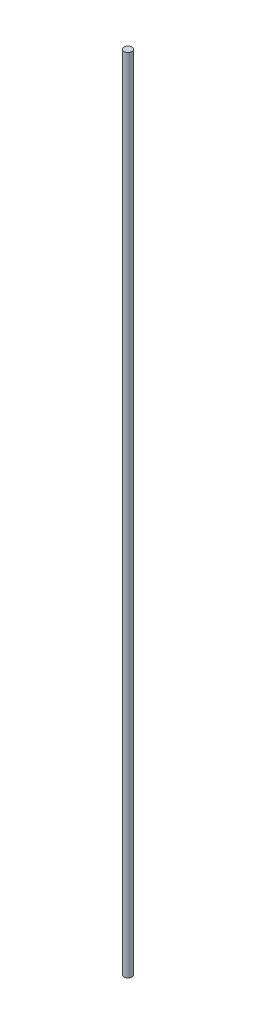
ISO-10303-21;
HEADER;
FILE_DESCRIPTION(('STEP AP214'),'2;1');
FILE_NAME('part.step','',(''),(''),'','','');
FILE_SCHEMA(('AUTOMOTIVE_DESIGN { 1 0 10303 214 1 1 1 1 }'));
ENDSEC;
DATA;
#1=APPLICATION_CONTEXT('core data for automotive mechanical design processes');
#2=APPLICATION_PROTOCOL_DEFINITION('international standard','automotive_design',2000,#1);
#3=PRODUCT_CONTEXT('',#1,'mechanical');
#4=PRODUCT('Part','Part','',(#3));
#5=PRODUCT_RELATED_PRODUCT_CATEGORY('part','',(#4));
#6=PRODUCT_DEFINITION_FORMATION('','',#4);
#7=PRODUCT_DEFINITION_CONTEXT('part definition',#1,'design');
#8=PRODUCT_DEFINITION('design','',#6,#7);
#9=PRODUCT_DEFINITION_SHAPE('','',#8);
#10=(LENGTH_UNIT() NAMED_UNIT(*) SI_UNIT(.MILLI.,.METRE.));
#11=(NAMED_UNIT(*) PLANE_ANGLE_UNIT() SI_UNIT($,.RADIAN.));
#12=(NAMED_UNIT(*) SI_UNIT($,.STERADIAN.) SOLID_ANGLE_UNIT());
#13=UNCERTAINTY_MEASURE_WITH_UNIT(LENGTH_MEASURE(1.E-05),#10,'distance_accuracy_value','');
#14=(GEOMETRIC_REPRESENTATION_CONTEXT(3) GLOBAL_UNCERTAINTY_ASSIGNED_CONTEXT((#13)) GLOBAL_UNIT_ASSIGNED_CONTEXT((#10,
#11,#12)) REPRESENTATION_CONTEXT('',''));
#15=CARTESIAN_POINT('',(0.,0.,0.));
#16=DIRECTION('',(0.,0.,1.));
#17=DIRECTION('',(1.,0.,0.));
#18=AXIS2_PLACEMENT_3D('',#15,#16,#17);
#19=CARTESIAN_POINT('',(0.,815.,0.));
#20=DIRECTION('',(0.,-1.,0.));
#21=DIRECTION('',(0.,0.,-1.));
#22=AXIS2_PLACEMENT_3D('',#19,#20,#21);
#23=CYLINDRICAL_SURFACE('',#22,4.);
#24=CARTESIAN_POINT('',(0.,815.,0.));
#25=DIRECTION('',(0.,1.,0.));
#26=DIRECTION('',(0.,0.,1.));
#27=AXIS2_PLACEMENT_3D('',#24,#25,#26);
#28=CIRCLE('',#27,4.);
#29=CARTESIAN_POINT('',(0.,815.,4.));
#30=VERTEX_POINT('',#29);
#31=EDGE_CURVE('E10',#30,#30,#28,.T.);
#32=ORIENTED_EDGE('',*,*,#31,.F.);
#33=EDGE_LOOP('',(#32));
#34=FACE_BOUND('',#33,.T.);
#35=CARTESIAN_POINT('',(0.,0.,0.));
#36=DIRECTION('',(0.,1.,0.));
#37=DIRECTION('',(0.,0.,1.));
#38=AXIS2_PLACEMENT_3D('',#35,#36,#37);
#39=CIRCLE('',#38,4.);
#40=CARTESIAN_POINT('',(0.,0.,4.));
#41=VERTEX_POINT('',#40);
#42=EDGE_CURVE('E36',#41,#41,#39,.T.);
#43=ORIENTED_EDGE('',*,*,#42,.T.);
#44=EDGE_LOOP('',(#43));
#45=FACE_BOUND('',#44,.T.);
#46=ADVANCED_FACE('F33',(#34,#45),#23,.T.);
#47=CARTESIAN_POINT('',(0.,815.,0.));
#48=DIRECTION('',(0.,1.,0.));
#49=DIRECTION('',(0.,0.,1.));
#50=AXIS2_PLACEMENT_3D('',#47,#48,#49);
#51=PLANE('',#50);
#52=ORIENTED_EDGE('',*,*,#31,.T.);
#53=EDGE_LOOP('',(#52));
#54=FACE_BOUND('',#53,.T.);
#55=ADVANCED_FACE('F48',(#54),#51,.T.);
#56=CARTESIAN_POINT('',(0.,0.,0.));
#57=DIRECTION('',(0.,1.,0.));
#58=DIRECTION('',(0.,0.,1.));
#59=AXIS2_PLACEMENT_3D('',#56,#57,#58);
#60=PLANE('',#59);
#61=ORIENTED_EDGE('',*,*,#42,.F.);
#62=EDGE_LOOP('',(#61));
#63=FACE_BOUND('',#62,.T.);
#64=ADVANCED_FACE('F46',(#63),#60,.F.);
#65=CLOSED_SHELL('',(#46,#55,#64));
#66=MANIFOLD_SOLID_BREP('B2',#65);
#67=ADVANCED_BREP_SHAPE_REPRESENTATION('',(#18,#66),#14);
#68=SHAPE_DEFINITION_REPRESENTATION(#9,#67);
ENDSEC;
END-ISO-10303-21;
